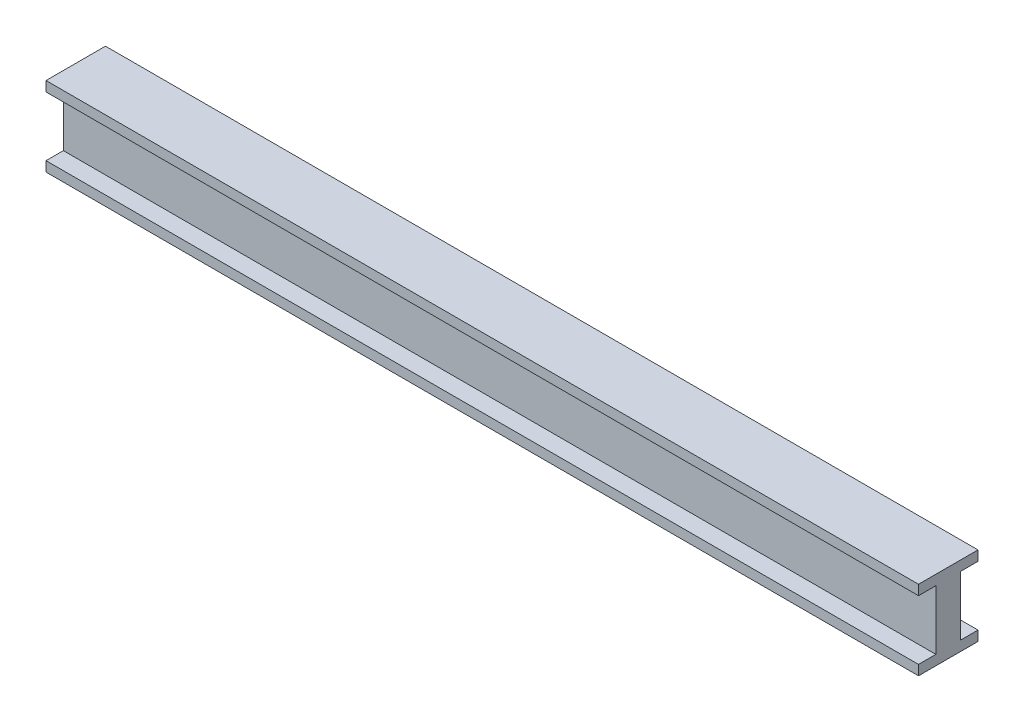
ISO-10303-21;
HEADER;
FILE_DESCRIPTION(('STEP AP214'),'2;1');
FILE_NAME('part.step','',(''),(''),'','','');
FILE_SCHEMA(('AUTOMOTIVE_DESIGN { 1 0 10303 214 1 1 1 1 }'));
ENDSEC;
DATA;
#1=APPLICATION_CONTEXT('core data for automotive mechanical design processes');
#2=APPLICATION_PROTOCOL_DEFINITION('international standard','automotive_design',2000,#1);
#3=PRODUCT_CONTEXT('',#1,'mechanical');
#4=PRODUCT('Part','Part','',(#3));
#5=PRODUCT_RELATED_PRODUCT_CATEGORY('part','',(#4));
#6=PRODUCT_DEFINITION_FORMATION('','',#4);
#7=PRODUCT_DEFINITION_CONTEXT('part definition',#1,'design');
#8=PRODUCT_DEFINITION('design','',#6,#7);
#9=PRODUCT_DEFINITION_SHAPE('','',#8);
#10=(LENGTH_UNIT() NAMED_UNIT(*) SI_UNIT(.MILLI.,.METRE.));
#11=(NAMED_UNIT(*) PLANE_ANGLE_UNIT() SI_UNIT($,.RADIAN.));
#12=(NAMED_UNIT(*) SI_UNIT($,.STERADIAN.) SOLID_ANGLE_UNIT());
#13=UNCERTAINTY_MEASURE_WITH_UNIT(LENGTH_MEASURE(1.E-05),#10,'distance_accuracy_value','');
#14=(GEOMETRIC_REPRESENTATION_CONTEXT(3) GLOBAL_UNCERTAINTY_ASSIGNED_CONTEXT((#13)) GLOBAL_UNIT_ASSIGNED_CONTEXT((#10,
#11,#12)) REPRESENTATION_CONTEXT('',''));
#15=CARTESIAN_POINT('',(0.,0.,0.));
#16=DIRECTION('',(0.,0.,1.));
#17=DIRECTION('',(1.,0.,0.));
#18=AXIS2_PLACEMENT_3D('',#15,#16,#17);
#19=CARTESIAN_POINT('',(558.8,0.,-19.05));
#20=DIRECTION('',(0.,0.,-1.));
#21=DIRECTION('',(0.,1.,0.));
#22=AXIS2_PLACEMENT_3D('',#19,#20,#21);
#23=PLANE('',#22);
#24=DIRECTION('',(0.,-1.,0.));
#25=VECTOR('',#24,1.);
#26=CARTESIAN_POINT('',(0.,0.,-19.05));
#27=LINE('',#26,#25);
#28=CARTESIAN_POINT('',(0.,25.4,-19.05));
#29=VERTEX_POINT('',#28);
#30=CARTESIAN_POINT('',(0.,19.05,-19.05));
#31=VERTEX_POINT('',#30);
#32=EDGE_CURVE('E215',#29,#31,#27,.T.);
#33=ORIENTED_EDGE('',*,*,#32,.F.);
#34=DIRECTION('',(-1.,0.,0.));
#35=VECTOR('',#34,1.);
#36=CARTESIAN_POINT('',(558.8,25.4,-19.05));
#37=LINE('',#36,#35);
#38=CARTESIAN_POINT('',(558.8,25.4,-19.05));
#39=VERTEX_POINT('',#38);
#40=EDGE_CURVE('E11',#39,#29,#37,.T.);
#41=ORIENTED_EDGE('',*,*,#40,.F.);
#42=DIRECTION('',(0.,-1.,0.));
#43=VECTOR('',#42,1.);
#44=CARTESIAN_POINT('',(558.8,0.,-19.05));
#45=LINE('',#44,#43);
#46=CARTESIAN_POINT('',(558.8,19.05,-19.05));
#47=VERTEX_POINT('',#46);
#48=EDGE_CURVE('E184',#39,#47,#45,.T.);
#49=ORIENTED_EDGE('',*,*,#48,.T.);
#50=DIRECTION('',(-1.,0.,0.));
#51=VECTOR('',#50,1.);
#52=CARTESIAN_POINT('',(558.8,19.05,-19.05));
#53=LINE('',#52,#51);
#54=EDGE_CURVE('E102',#47,#31,#53,.T.);
#55=ORIENTED_EDGE('',*,*,#54,.T.);
#56=EDGE_LOOP('',(#33,#41,#49,#55));
#57=FACE_BOUND('',#56,.T.);
#58=ADVANCED_FACE('F39',(#57),#23,.T.);
#59=CARTESIAN_POINT('',(558.8,25.4,0.));
#60=DIRECTION('',(0.,1.,0.));
#61=DIRECTION('',(0.,0.,1.));
#62=AXIS2_PLACEMENT_3D('',#59,#60,#61);
#63=PLANE('',#62);
#64=DIRECTION('',(0.,0.,-1.));
#65=VECTOR('',#64,1.);
#66=CARTESIAN_POINT('',(0.,25.4,0.));
#67=LINE('',#66,#65);
#68=CARTESIAN_POINT('',(0.,25.4,19.05));
#69=VERTEX_POINT('',#68);
#70=EDGE_CURVE('E209',#69,#29,#67,.T.);
#71=ORIENTED_EDGE('',*,*,#70,.F.);
#72=DIRECTION('',(-1.,0.,0.));
#73=VECTOR('',#72,1.);
#74=CARTESIAN_POINT('',(558.8,25.4,19.05));
#75=LINE('',#74,#73);
#76=CARTESIAN_POINT('',(558.8,25.4,19.05));
#77=VERTEX_POINT('',#76);
#78=EDGE_CURVE('E48',#77,#69,#75,.T.);
#79=ORIENTED_EDGE('',*,*,#78,.F.);
#80=DIRECTION('',(0.,0.,-1.));
#81=VECTOR('',#80,1.);
#82=CARTESIAN_POINT('',(558.8,25.4,0.));
#83=LINE('',#82,#81);
#84=EDGE_CURVE('E180',#77,#39,#83,.T.);
#85=ORIENTED_EDGE('',*,*,#84,.T.);
#86=ORIENTED_EDGE('',*,*,#40,.T.);
#87=EDGE_LOOP('',(#71,#79,#85,#86));
#88=FACE_BOUND('',#87,.T.);
#89=ADVANCED_FACE('F263',(#88),#63,.T.);
#90=CARTESIAN_POINT('',(558.8,0.,19.05));
#91=DIRECTION('',(0.,0.,-1.));
#92=DIRECTION('',(0.,1.,0.));
#93=AXIS2_PLACEMENT_3D('',#90,#91,#92);
#94=PLANE('',#93);
#95=DIRECTION('',(0.,-1.,0.));
#96=VECTOR('',#95,1.);
#97=CARTESIAN_POINT('',(0.,0.,19.05));
#98=LINE('',#97,#96);
#99=CARTESIAN_POINT('',(0.,19.05,19.05));
#100=VERTEX_POINT('',#99);
#101=EDGE_CURVE('E200',#69,#100,#98,.T.);
#102=ORIENTED_EDGE('',*,*,#101,.T.);
#103=DIRECTION('',(-1.,0.,0.));
#104=VECTOR('',#103,1.);
#105=CARTESIAN_POINT('',(558.8,19.05,19.05));
#106=LINE('',#105,#104);
#107=CARTESIAN_POINT('',(558.8,19.05,19.05));
#108=VERTEX_POINT('',#107);
#109=EDGE_CURVE('E253',#108,#100,#106,.T.);
#110=ORIENTED_EDGE('',*,*,#109,.F.);
#111=DIRECTION('',(0.,-1.,0.));
#112=VECTOR('',#111,1.);
#113=CARTESIAN_POINT('',(558.8,0.,19.05));
#114=LINE('',#113,#112);
#115=EDGE_CURVE('E175',#77,#108,#114,.T.);
#116=ORIENTED_EDGE('',*,*,#115,.F.);
#117=ORIENTED_EDGE('',*,*,#78,.T.);
#118=EDGE_LOOP('',(#102,#110,#116,#117));
#119=FACE_BOUND('',#118,.T.);
#120=ADVANCED_FACE('F257',(#119),#94,.F.);
#121=CARTESIAN_POINT('',(558.8,19.05,0.));
#122=DIRECTION('',(0.,1.,0.));
#123=DIRECTION('',(0.,0.,1.));
#124=AXIS2_PLACEMENT_3D('',#121,#122,#123);
#125=PLANE('',#124);
#126=DIRECTION('',(0.,0.,-1.));
#127=VECTOR('',#126,1.);
#128=CARTESIAN_POINT('',(0.,19.05,0.));
#129=LINE('',#128,#127);
#130=CARTESIAN_POINT('',(0.,19.05,7.9375));
#131=VERTEX_POINT('',#130);
#132=EDGE_CURVE('E189',#100,#131,#129,.T.);
#133=ORIENTED_EDGE('',*,*,#132,.T.);
#134=DIRECTION('',(-1.,0.,0.));
#135=VECTOR('',#134,1.);
#136=CARTESIAN_POINT('',(558.8,19.05,7.9375));
#137=LINE('',#136,#135);
#138=CARTESIAN_POINT('',(558.8,19.05,7.9375));
#139=VERTEX_POINT('',#138);
#140=EDGE_CURVE('E250',#139,#131,#137,.T.);
#141=ORIENTED_EDGE('',*,*,#140,.F.);
#142=DIRECTION('',(0.,0.,-1.));
#143=VECTOR('',#142,1.);
#144=CARTESIAN_POINT('',(558.8,19.05,0.));
#145=LINE('',#144,#143);
#146=EDGE_CURVE('E171',#108,#139,#145,.T.);
#147=ORIENTED_EDGE('',*,*,#146,.F.);
#148=ORIENTED_EDGE('',*,*,#109,.T.);
#149=EDGE_LOOP('',(#133,#141,#147,#148));
#150=FACE_BOUND('',#149,.T.);
#151=ADVANCED_FACE('F285',(#150),#125,.F.);
#152=CARTESIAN_POINT('',(558.8,0.,7.9375));
#153=DIRECTION('',(0.,0.,1.));
#154=DIRECTION('',(1.,0.,0.));
#155=AXIS2_PLACEMENT_3D('',#152,#153,#154);
#156=PLANE('',#155);
#157=DIRECTION('',(0.,1.,0.));
#158=VECTOR('',#157,1.);
#159=CARTESIAN_POINT('',(0.,0.,7.9375));
#160=LINE('',#159,#158);
#161=CARTESIAN_POINT('',(0.,-19.05,7.9375));
#162=VERTEX_POINT('',#161);
#163=EDGE_CURVE('E199',#162,#131,#160,.T.);
#164=ORIENTED_EDGE('',*,*,#163,.F.);
#165=DIRECTION('',(-1.,0.,0.));
#166=VECTOR('',#165,1.);
#167=CARTESIAN_POINT('',(558.8,-19.05,7.9375));
#168=LINE('',#167,#166);
#169=CARTESIAN_POINT('',(558.8,-19.05,7.9375));
#170=VERTEX_POINT('',#169);
#171=EDGE_CURVE('E247',#170,#162,#168,.T.);
#172=ORIENTED_EDGE('',*,*,#171,.F.);
#173=DIRECTION('',(0.,1.,0.));
#174=VECTOR('',#173,1.);
#175=CARTESIAN_POINT('',(558.8,0.,7.9375));
#176=LINE('',#175,#174);
#177=EDGE_CURVE('E164',#170,#139,#176,.T.);
#178=ORIENTED_EDGE('',*,*,#177,.T.);
#179=ORIENTED_EDGE('',*,*,#140,.T.);
#180=EDGE_LOOP('',(#164,#172,#178,#179));
#181=FACE_BOUND('',#180,.T.);
#182=ADVANCED_FACE('F294',(#181),#156,.T.);
#183=CARTESIAN_POINT('',(558.8,-19.05,0.));
#184=DIRECTION('',(0.,1.,0.));
#185=DIRECTION('',(0.,0.,1.));
#186=AXIS2_PLACEMENT_3D('',#183,#184,#185);
#187=PLANE('',#186);
#188=DIRECTION('',(0.,0.,-1.));
#189=VECTOR('',#188,1.);
#190=CARTESIAN_POINT('',(0.,-19.05,0.));
#191=LINE('',#190,#189);
#192=CARTESIAN_POINT('',(0.,-19.05,19.05));
#193=VERTEX_POINT('',#192);
#194=EDGE_CURVE('E208',#193,#162,#191,.T.);
#195=ORIENTED_EDGE('',*,*,#194,.F.);
#196=DIRECTION('',(-1.,0.,0.));
#197=VECTOR('',#196,1.);
#198=CARTESIAN_POINT('',(558.8,-19.05,19.05));
#199=LINE('',#198,#197);
#200=CARTESIAN_POINT('',(558.8,-19.05,19.05));
#201=VERTEX_POINT('',#200);
#202=EDGE_CURVE('E244',#201,#193,#199,.T.);
#203=ORIENTED_EDGE('',*,*,#202,.F.);
#204=DIRECTION('',(0.,0.,-1.));
#205=VECTOR('',#204,1.);
#206=CARTESIAN_POINT('',(558.8,-19.05,0.));
#207=LINE('',#206,#205);
#208=EDGE_CURVE('E155',#201,#170,#207,.T.);
#209=ORIENTED_EDGE('',*,*,#208,.T.);
#210=ORIENTED_EDGE('',*,*,#171,.T.);
#211=EDGE_LOOP('',(#195,#203,#209,#210));
#212=FACE_BOUND('',#211,.T.);
#213=ADVANCED_FACE('F306',(#212),#187,.T.);
#214=CARTESIAN_POINT('',(558.8,0.,19.05));
#215=DIRECTION('',(0.,0.,1.));
#216=DIRECTION('',(1.,0.,0.));
#217=AXIS2_PLACEMENT_3D('',#214,#215,#216);
#218=PLANE('',#217);
#219=DIRECTION('',(0.,1.,0.));
#220=VECTOR('',#219,1.);
#221=CARTESIAN_POINT('',(0.,0.,19.05));
#222=LINE('',#221,#220);
#223=CARTESIAN_POINT('',(0.,-25.4,19.05));
#224=VERTEX_POINT('',#223);
#225=EDGE_CURVE('E271',#224,#193,#222,.T.);
#226=ORIENTED_EDGE('',*,*,#225,.F.);
#227=DIRECTION('',(-1.,0.,0.));
#228=VECTOR('',#227,1.);
#229=CARTESIAN_POINT('',(558.8,-25.4,19.05));
#230=LINE('',#229,#228);
#231=CARTESIAN_POINT('',(558.8,-25.4,19.05));
#232=VERTEX_POINT('',#231);
#233=EDGE_CURVE('E234',#232,#224,#230,.T.);
#234=ORIENTED_EDGE('',*,*,#233,.F.);
#235=DIRECTION('',(0.,1.,0.));
#236=VECTOR('',#235,1.);
#237=CARTESIAN_POINT('',(558.8,0.,19.05));
#238=LINE('',#237,#236);
#239=EDGE_CURVE('E163',#232,#201,#238,.T.);
#240=ORIENTED_EDGE('',*,*,#239,.T.);
#241=ORIENTED_EDGE('',*,*,#202,.T.);
#242=EDGE_LOOP('',(#226,#234,#240,#241));
#243=FACE_BOUND('',#242,.T.);
#244=ADVANCED_FACE('F307',(#243),#218,.T.);
#245=CARTESIAN_POINT('',(558.8,-25.4,0.));
#246=DIRECTION('',(0.,1.,0.));
#247=DIRECTION('',(0.,0.,1.));
#248=AXIS2_PLACEMENT_3D('',#245,#246,#247);
#249=PLANE('',#248);
#250=DIRECTION('',(0.,0.,-1.));
#251=VECTOR('',#250,1.);
#252=CARTESIAN_POINT('',(0.,-25.4,0.));
#253=LINE('',#252,#251);
#254=CARTESIAN_POINT('',(0.,-25.4,-19.05));
#255=VERTEX_POINT('',#254);
#256=EDGE_CURVE('E229',#224,#255,#253,.T.);
#257=ORIENTED_EDGE('',*,*,#256,.T.);
#258=DIRECTION('',(-1.,0.,0.));
#259=VECTOR('',#258,1.);
#260=CARTESIAN_POINT('',(558.8,-25.4,-19.05));
#261=LINE('',#260,#259);
#262=CARTESIAN_POINT('',(558.8,-25.4,-19.05));
#263=VERTEX_POINT('',#262);
#264=EDGE_CURVE('E226',#263,#255,#261,.T.);
#265=ORIENTED_EDGE('',*,*,#264,.F.);
#266=DIRECTION('',(0.,0.,-1.));
#267=VECTOR('',#266,1.);
#268=CARTESIAN_POINT('',(558.8,-25.4,0.));
#269=LINE('',#268,#267);
#270=EDGE_CURVE('E157',#232,#263,#269,.T.);
#271=ORIENTED_EDGE('',*,*,#270,.F.);
#272=ORIENTED_EDGE('',*,*,#233,.T.);
#273=EDGE_LOOP('',(#257,#265,#271,#272));
#274=FACE_BOUND('',#273,.T.);
#275=ADVANCED_FACE('F227',(#274),#249,.F.);
#276=CARTESIAN_POINT('',(558.8,0.,-19.05));
#277=DIRECTION('',(0.,0.,1.));
#278=DIRECTION('',(1.,0.,0.));
#279=AXIS2_PLACEMENT_3D('',#276,#277,#278);
#280=PLANE('',#279);
#281=DIRECTION('',(0.,1.,0.));
#282=VECTOR('',#281,1.);
#283=CARTESIAN_POINT('',(0.,0.,-19.05));
#284=LINE('',#283,#282);
#285=CARTESIAN_POINT('',(0.,-19.05,-19.05));
#286=VERTEX_POINT('',#285);
#287=EDGE_CURVE('E237',#255,#286,#284,.T.);
#288=ORIENTED_EDGE('',*,*,#287,.T.);
#289=DIRECTION('',(-1.,0.,0.));
#290=VECTOR('',#289,1.);
#291=CARTESIAN_POINT('',(558.8,-19.05,-19.05));
#292=LINE('',#291,#290);
#293=CARTESIAN_POINT('',(558.8,-19.05,-19.05));
#294=VERTEX_POINT('',#293);
#295=EDGE_CURVE('E142',#294,#286,#292,.T.);
#296=ORIENTED_EDGE('',*,*,#295,.F.);
#297=DIRECTION('',(0.,1.,0.));
#298=VECTOR('',#297,1.);
#299=CARTESIAN_POINT('',(558.8,0.,-19.05));
#300=LINE('',#299,#298);
#301=EDGE_CURVE('E151',#263,#294,#300,.T.);
#302=ORIENTED_EDGE('',*,*,#301,.F.);
#303=ORIENTED_EDGE('',*,*,#264,.T.);
#304=EDGE_LOOP('',(#288,#296,#302,#303));
#305=FACE_BOUND('',#304,.T.);
#306=ADVANCED_FACE('F236',(#305),#280,.F.);
#307=CARTESIAN_POINT('',(0.,-19.05,-7.9375));
#308=VERTEX_POINT('',#307);
#309=EDGE_CURVE('E140',#308,#286,#191,.T.);
#310=ORIENTED_EDGE('',*,*,#309,.F.);
#311=DIRECTION('',(-1.,0.,0.));
#312=VECTOR('',#311,1.);
#313=CARTESIAN_POINT('',(558.8,-19.05,-7.9375));
#314=LINE('',#313,#312);
#315=CARTESIAN_POINT('',(558.8,-19.05,-7.9375));
#316=VERTEX_POINT('',#315);
#317=EDGE_CURVE('E134',#316,#308,#314,.T.);
#318=ORIENTED_EDGE('',*,*,#317,.F.);
#319=EDGE_CURVE('E138',#316,#294,#207,.T.);
#320=ORIENTED_EDGE('',*,*,#319,.T.);
#321=ORIENTED_EDGE('',*,*,#295,.T.);
#322=EDGE_LOOP('',(#310,#318,#320,#321));
#323=FACE_BOUND('',#322,.T.);
#324=ADVANCED_FACE('F136',(#323),#187,.T.);
#325=CARTESIAN_POINT('',(558.8,0.,-7.9375));
#326=DIRECTION('',(0.,0.,1.));
#327=DIRECTION('',(1.,0.,0.));
#328=AXIS2_PLACEMENT_3D('',#325,#326,#327);
#329=PLANE('',#328);
#330=DIRECTION('',(0.,1.,0.));
#331=VECTOR('',#330,1.);
#332=CARTESIAN_POINT('',(0.,0.,-7.9375));
#333=LINE('',#332,#331);
#334=CARTESIAN_POINT('',(0.,19.05,-7.9375));
#335=VERTEX_POINT('',#334);
#336=EDGE_CURVE('E95',#308,#335,#333,.T.);
#337=ORIENTED_EDGE('',*,*,#336,.T.);
#338=DIRECTION('',(-1.,0.,0.));
#339=VECTOR('',#338,1.);
#340=CARTESIAN_POINT('',(558.8,19.05,-7.9375));
#341=LINE('',#340,#339);
#342=CARTESIAN_POINT('',(558.8,19.05,-7.9375));
#343=VERTEX_POINT('',#342);
#344=EDGE_CURVE('E143',#343,#335,#341,.T.);
#345=ORIENTED_EDGE('',*,*,#344,.F.);
#346=DIRECTION('',(0.,1.,0.));
#347=VECTOR('',#346,1.);
#348=CARTESIAN_POINT('',(558.8,0.,-7.9375));
#349=LINE('',#348,#347);
#350=EDGE_CURVE('E145',#316,#343,#349,.T.);
#351=ORIENTED_EDGE('',*,*,#350,.F.);
#352=ORIENTED_EDGE('',*,*,#317,.T.);
#353=EDGE_LOOP('',(#337,#345,#351,#352));
#354=FACE_BOUND('',#353,.T.);
#355=ADVANCED_FACE('F146',(#354),#329,.F.);
#356=EDGE_CURVE('E186',#335,#31,#129,.T.);
#357=ORIENTED_EDGE('',*,*,#356,.T.);
#358=ORIENTED_EDGE('',*,*,#54,.F.);
#359=EDGE_CURVE('E56',#343,#47,#145,.T.);
#360=ORIENTED_EDGE('',*,*,#359,.F.);
#361=ORIENTED_EDGE('',*,*,#344,.T.);
#362=EDGE_LOOP('',(#357,#358,#360,#361));
#363=FACE_BOUND('',#362,.T.);
#364=ADVANCED_FACE('F281',(#363),#125,.F.);
#365=CARTESIAN_POINT('',(558.8,0.,0.));
#366=DIRECTION('',(1.,0.,0.));
#367=DIRECTION('',(0.,0.,-1.));
#368=AXIS2_PLACEMENT_3D('',#365,#366,#367);
#369=PLANE('',#368);
#370=ORIENTED_EDGE('',*,*,#48,.F.);
#371=ORIENTED_EDGE('',*,*,#84,.F.);
#372=ORIENTED_EDGE('',*,*,#115,.T.);
#373=ORIENTED_EDGE('',*,*,#146,.T.);
#374=ORIENTED_EDGE('',*,*,#177,.F.);
#375=ORIENTED_EDGE('',*,*,#208,.F.);
#376=ORIENTED_EDGE('',*,*,#239,.F.);
#377=ORIENTED_EDGE('',*,*,#270,.T.);
#378=ORIENTED_EDGE('',*,*,#301,.T.);
#379=ORIENTED_EDGE('',*,*,#319,.F.);
#380=ORIENTED_EDGE('',*,*,#350,.T.);
#381=ORIENTED_EDGE('',*,*,#359,.T.);
#382=EDGE_LOOP('',(#370,#371,#372,#373,#374,#375,#376,#377,#378,#379,#380,#381));
#383=FACE_BOUND('',#382,.T.);
#384=ADVANCED_FACE('F149',(#383),#369,.T.);
#385=CARTESIAN_POINT('',(0.,0.,0.));
#386=DIRECTION('',(1.,0.,0.));
#387=DIRECTION('',(0.,0.,-1.));
#388=AXIS2_PLACEMENT_3D('',#385,#386,#387);
#389=PLANE('',#388);
#390=ORIENTED_EDGE('',*,*,#32,.T.);
#391=ORIENTED_EDGE('',*,*,#356,.F.);
#392=ORIENTED_EDGE('',*,*,#336,.F.);
#393=ORIENTED_EDGE('',*,*,#309,.T.);
#394=ORIENTED_EDGE('',*,*,#287,.F.);
#395=ORIENTED_EDGE('',*,*,#256,.F.);
#396=ORIENTED_EDGE('',*,*,#225,.T.);
#397=ORIENTED_EDGE('',*,*,#194,.T.);
#398=ORIENTED_EDGE('',*,*,#163,.T.);
#399=ORIENTED_EDGE('',*,*,#132,.F.);
#400=ORIENTED_EDGE('',*,*,#101,.F.);
#401=ORIENTED_EDGE('',*,*,#70,.T.);
#402=EDGE_LOOP('',(#390,#391,#392,#393,#394,#395,#396,#397,#398,#399,#400,#401));
#403=FACE_BOUND('',#402,.T.);
#404=ADVANCED_FACE('F262',(#403),#389,.F.);
#405=CLOSED_SHELL('',(#58,#89,#120,#151,#182,#213,#244,#275,#306,#324,#355,#364,#384,#404));
#406=MANIFOLD_SOLID_BREP('B2',#405);
#407=ADVANCED_BREP_SHAPE_REPRESENTATION('',(#18,#406),#14);
#408=SHAPE_DEFINITION_REPRESENTATION(#9,#407);
ENDSEC;
END-ISO-10303-21;
